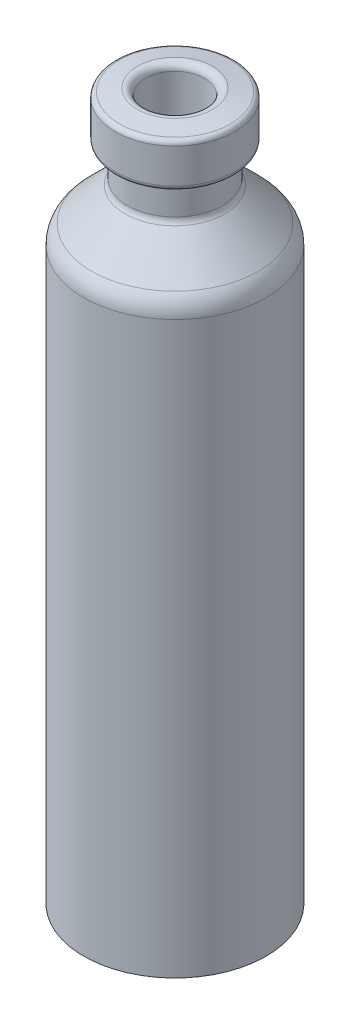
ISO-10303-21;
HEADER;
FILE_DESCRIPTION(('STEP AP214'),'2;1');
FILE_NAME('part.step','',(''),(''),'','','');
FILE_SCHEMA(('AUTOMOTIVE_DESIGN { 1 0 10303 214 1 1 1 1 }'));
ENDSEC;
DATA;
#1=APPLICATION_CONTEXT('core data for automotive mechanical design processes');
#2=APPLICATION_PROTOCOL_DEFINITION('international standard','automotive_design',2000,#1);
#3=PRODUCT_CONTEXT('',#1,'mechanical');
#4=PRODUCT('Part','Part','',(#3));
#5=PRODUCT_RELATED_PRODUCT_CATEGORY('part','',(#4));
#6=PRODUCT_DEFINITION_FORMATION('','',#4);
#7=PRODUCT_DEFINITION_CONTEXT('part definition',#1,'design');
#8=PRODUCT_DEFINITION('design','',#6,#7);
#9=PRODUCT_DEFINITION_SHAPE('','',#8);
#10=(LENGTH_UNIT() NAMED_UNIT(*) SI_UNIT(.MILLI.,.METRE.));
#11=(NAMED_UNIT(*) PLANE_ANGLE_UNIT() SI_UNIT($,.RADIAN.));
#12=(NAMED_UNIT(*) SI_UNIT($,.STERADIAN.) SOLID_ANGLE_UNIT());
#13=UNCERTAINTY_MEASURE_WITH_UNIT(LENGTH_MEASURE(1.E-05),#10,'distance_accuracy_value','');
#14=(GEOMETRIC_REPRESENTATION_CONTEXT(3) GLOBAL_UNCERTAINTY_ASSIGNED_CONTEXT((#13)) GLOBAL_UNIT_ASSIGNED_CONTEXT((#10,
#11,#12)) REPRESENTATION_CONTEXT('',''));
#15=CARTESIAN_POINT('',(0.,0.,0.));
#16=DIRECTION('',(0.,0.,1.));
#17=DIRECTION('',(1.,0.,0.));
#18=AXIS2_PLACEMENT_3D('',#15,#16,#17);
#19=CARTESIAN_POINT('',(0.,0.,0.85));
#20=DIRECTION('',(0.,-1.,0.));
#21=DIRECTION('',(0.,0.,-1.));
#22=AXIS2_PLACEMENT_3D('',#19,#20,#21);
#23=PLANE('',#22);
#24=CARTESIAN_POINT('',(0.,0.,5.475));
#25=DIRECTION('',(0.,-1.,0.));
#26=DIRECTION('',(0.,0.,-1.));
#27=AXIS2_PLACEMENT_3D('',#24,#25,#26);
#28=CIRCLE('',#27,5.475);
#29=CARTESIAN_POINT('',(0.,0.,0.));
#30=VERTEX_POINT('',#29);
#31=EDGE_CURVE('E10',#30,#30,#28,.T.);
#32=ORIENTED_EDGE('',*,*,#31,.T.);
#33=EDGE_LOOP('',(#32));
#34=FACE_BOUND('',#33,.T.);
#35=CARTESIAN_POINT('',(0.,0.,5.475));
#36=DIRECTION('',(0.,-1.,0.));
#37=DIRECTION('',(0.,0.,-1.));
#38=AXIS2_PLACEMENT_3D('',#35,#36,#37);
#39=CIRCLE('',#38,4.625);
#40=CARTESIAN_POINT('',(0.,0.,0.85));
#41=VERTEX_POINT('',#40);
#42=EDGE_CURVE('E93',#41,#41,#39,.T.);
#43=ORIENTED_EDGE('',*,*,#42,.F.);
#44=EDGE_LOOP('',(#43));
#45=FACE_BOUND('',#44,.T.);
#46=ADVANCED_FACE('F35',(#34,#45),#23,.T.);
#47=CARTESIAN_POINT('',(0.,0.,5.475));
#48=DIRECTION('',(0.,-1.,0.));
#49=DIRECTION('',(0.,0.,-1.));
#50=AXIS2_PLACEMENT_3D('',#47,#48,#49);
#51=CYLINDRICAL_SURFACE('',#50,5.475);
#52=CARTESIAN_POINT('',(0.,34.2327693881703,5.475));
#53=DIRECTION('',(0.,-1.,0.));
#54=DIRECTION('',(0.,0.,-1.));
#55=AXIS2_PLACEMENT_3D('',#52,#53,#54);
#56=CIRCLE('',#55,5.475);
#57=CARTESIAN_POINT('',(0.,34.2327693881703,0.));
#58=VERTEX_POINT('',#57);
#59=EDGE_CURVE('E41',#58,#58,#56,.T.);
#60=ORIENTED_EDGE('',*,*,#59,.T.);
#61=EDGE_LOOP('',(#60));
#62=FACE_BOUND('',#61,.T.);
#63=ORIENTED_EDGE('',*,*,#31,.F.);
#64=EDGE_LOOP('',(#63));
#65=FACE_BOUND('',#64,.T.);
#66=ADVANCED_FACE('F101',(#62,#65),#51,.T.);
#67=CARTESIAN_POINT('',(0.,34.2327693881703,5.475));
#68=DIRECTION('',(0.,-1.,0.));
#69=DIRECTION('',(0.,0.,-1.));
#70=AXIS2_PLACEMENT_3D('',#67,#68,#69);
#71=TOROIDAL_SURFACE('',#70,3.875,1.6);
#72=CARTESIAN_POINT('',(0.,35.3695404836065,5.475));
#73=DIRECTION('',(0.,-1.,0.));
#74=DIRECTION('',(0.,0.,-1.));
#75=AXIS2_PLACEMENT_3D('',#72,#73,#74);
#76=CIRCLE('',#75,5.00094470405111);
#77=CARTESIAN_POINT('',(0.,35.3695404836065,0.474055295948889));
#78=VERTEX_POINT('',#77);
#79=EDGE_CURVE('E45',#78,#78,#76,.T.);
#80=ORIENTED_EDGE('',*,*,#79,.T.);
#81=EDGE_LOOP('',(#80));
#82=FACE_BOUND('',#81,.T.);
#83=ORIENTED_EDGE('',*,*,#59,.F.);
#84=EDGE_LOOP('',(#83));
#85=FACE_BOUND('',#84,.T.);
#86=ADVANCED_FACE('F105',(#82,#85),#71,.T.);
#87=CARTESIAN_POINT('',(0.,35.3695404836065,5.475));
#88=DIRECTION('',(0.,-1.,0.));
#89=DIRECTION('',(0.,0.,-1.));
#90=AXIS2_PLACEMENT_3D('',#87,#88,#89);
#91=CONICAL_SURFACE('',#90,5.00094470405111,0.790182815880806);
#92=CARTESIAN_POINT('',(0.,37.353268598873,5.475));
#93=DIRECTION('',(0.,-1.,0.));
#94=DIRECTION('',(0.,0.,-1.));
#95=AXIS2_PLACEMENT_3D('',#92,#93,#94);
#96=CIRCLE('',#95,2.99814227998402);
#97=CARTESIAN_POINT('',(0.,37.353268598873,2.47685772001598));
#98=VERTEX_POINT('',#97);
#99=EDGE_CURVE('E49',#98,#98,#96,.T.);
#100=ORIENTED_EDGE('',*,*,#99,.T.);
#101=EDGE_LOOP('',(#100));
#102=FACE_BOUND('',#101,.T.);
#103=ORIENTED_EDGE('',*,*,#79,.F.);
#104=EDGE_LOOP('',(#103));
#105=FACE_BOUND('',#104,.T.);
#106=ADVANCED_FACE('F109',(#102,#105),#91,.T.);
#107=CARTESIAN_POINT('',(0.,37.7085095661968,5.475));
#108=DIRECTION('',(0.,-1.,0.));
#109=DIRECTION('',(0.,0.,-1.));
#110=AXIS2_PLACEMENT_3D('',#107,#108,#109);
#111=TOROIDAL_SURFACE('',#110,3.34999999999999,0.499999999999997);
#112=CARTESIAN_POINT('',(0.,37.7085095661968,5.475));
#113=DIRECTION('',(0.,-1.,0.));
#114=DIRECTION('',(0.,0.,-1.));
#115=AXIS2_PLACEMENT_3D('',#112,#113,#114);
#116=CIRCLE('',#115,2.85);
#117=CARTESIAN_POINT('',(0.,37.7085095661968,2.625));
#118=VERTEX_POINT('',#117);
#119=EDGE_CURVE('E54',#118,#118,#116,.T.);
#120=ORIENTED_EDGE('',*,*,#119,.T.);
#121=EDGE_LOOP('',(#120));
#122=FACE_BOUND('',#121,.T.);
#123=ORIENTED_EDGE('',*,*,#99,.F.);
#124=EDGE_LOOP('',(#123));
#125=FACE_BOUND('',#124,.T.);
#126=ADVANCED_FACE('F116',(#122,#125),#111,.F.);
#127=CARTESIAN_POINT('',(0.,0.,5.475));
#128=DIRECTION('',(0.,-1.,0.));
#129=DIRECTION('',(0.,0.,-1.));
#130=AXIS2_PLACEMENT_3D('',#127,#128,#129);
#131=CYLINDRICAL_SURFACE('',#130,2.85);
#132=CARTESIAN_POINT('',(0.,39.1755387390937,5.475));
#133=DIRECTION('',(0.,-1.,0.));
#134=DIRECTION('',(0.,0.,-1.));
#135=AXIS2_PLACEMENT_3D('',#132,#133,#134);
#136=CIRCLE('',#135,2.84999999999999);
#137=CARTESIAN_POINT('',(0.,39.1755387390937,2.625));
#138=VERTEX_POINT('',#137);
#139=EDGE_CURVE('E57',#138,#138,#136,.T.);
#140=ORIENTED_EDGE('',*,*,#139,.T.);
#141=EDGE_LOOP('',(#140));
#142=FACE_BOUND('',#141,.T.);
#143=ORIENTED_EDGE('',*,*,#119,.F.);
#144=EDGE_LOOP('',(#143));
#145=FACE_BOUND('',#144,.T.);
#146=ADVANCED_FACE('F120',(#142,#145),#131,.T.);
#147=CARTESIAN_POINT('',(0.,39.1755387390938,5.475));
#148=DIRECTION('',(0.,-1.,0.));
#149=DIRECTION('',(0.,0.,-1.));
#150=AXIS2_PLACEMENT_3D('',#147,#148,#149);
#151=TOROIDAL_SURFACE('',#150,3.15,0.300000000000001);
#152=CARTESIAN_POINT('',(0.,39.4653164869805,5.475));
#153=DIRECTION('',(0.,-1.,0.));
#154=DIRECTION('',(0.,0.,-1.));
#155=AXIS2_PLACEMENT_3D('',#152,#153,#154);
#156=CIRCLE('',#155,3.07235428646924);
#157=CARTESIAN_POINT('',(0.,39.4653164869805,2.40264571353076));
#158=VERTEX_POINT('',#157);
#159=EDGE_CURVE('E60',#158,#158,#156,.T.);
#160=ORIENTED_EDGE('',*,*,#159,.T.);
#161=EDGE_LOOP('',(#160));
#162=FACE_BOUND('',#161,.T.);
#163=ORIENTED_EDGE('',*,*,#139,.F.);
#164=EDGE_LOOP('',(#163));
#165=FACE_BOUND('',#164,.T.);
#166=ADVANCED_FACE('F124',(#162,#165),#151,.F.);
#167=CARTESIAN_POINT('',(0.,39.4653164869805,5.475));
#168=DIRECTION('',(0.,1.,0.));
#169=DIRECTION('',(0.,0.,1.));
#170=AXIS2_PLACEMENT_3D('',#167,#168,#169);
#171=CONICAL_SURFACE('',#170,3.07235428646924,1.30899693899574);
#172=CARTESIAN_POINT('',(0.,39.540420348507,5.475));
#173=DIRECTION('',(0.,-1.,0.));
#174=DIRECTION('',(0.,0.,-1.));
#175=AXIS2_PLACEMENT_3D('',#172,#173,#174);
#176=CIRCLE('',#175,3.35264571353076);
#177=CARTESIAN_POINT('',(0.,39.540420348507,2.12235428646924));
#178=VERTEX_POINT('',#177);
#179=EDGE_CURVE('E63',#178,#178,#176,.T.);
#180=ORIENTED_EDGE('',*,*,#179,.T.);
#181=EDGE_LOOP('',(#180));
#182=FACE_BOUND('',#181,.T.);
#183=ORIENTED_EDGE('',*,*,#159,.F.);
#184=EDGE_LOOP('',(#183));
#185=FACE_BOUND('',#184,.T.);
#186=ADVANCED_FACE('F128',(#182,#185),#171,.T.);
#187=CARTESIAN_POINT('',(0.,39.8301980963937,5.475));
#188=DIRECTION('',(0.,-1.,0.));
#189=DIRECTION('',(0.,0.,-1.));
#190=AXIS2_PLACEMENT_3D('',#187,#188,#189);
#191=TOROIDAL_SURFACE('',#190,3.27499999999999,0.300000000000001);
#192=CARTESIAN_POINT('',(0.,39.8301980963937,5.475));
#193=DIRECTION('',(0.,-1.,0.));
#194=DIRECTION('',(0.,0.,-1.));
#195=AXIS2_PLACEMENT_3D('',#192,#193,#194);
#196=CIRCLE('',#195,3.57499999999999);
#197=CARTESIAN_POINT('',(0.,39.8301980963937,1.90000000000001));
#198=VERTEX_POINT('',#197);
#199=EDGE_CURVE('E66',#198,#198,#196,.T.);
#200=ORIENTED_EDGE('',*,*,#199,.T.);
#201=EDGE_LOOP('',(#200));
#202=FACE_BOUND('',#201,.T.);
#203=ORIENTED_EDGE('',*,*,#179,.F.);
#204=EDGE_LOOP('',(#203));
#205=FACE_BOUND('',#204,.T.);
#206=ADVANCED_FACE('F132',(#202,#205),#191,.T.);
#207=CARTESIAN_POINT('',(0.,0.,5.475));
#208=DIRECTION('',(0.,-1.,0.));
#209=DIRECTION('',(0.,0.,-1.));
#210=AXIS2_PLACEMENT_3D('',#207,#208,#209);
#211=CYLINDRICAL_SURFACE('',#210,3.575);
#212=CARTESIAN_POINT('',(0.,41.9028145278069,5.475));
#213=DIRECTION('',(0.,-1.,0.));
#214=DIRECTION('',(0.,0.,-1.));
#215=AXIS2_PLACEMENT_3D('',#212,#213,#214);
#216=CIRCLE('',#215,3.575);
#217=CARTESIAN_POINT('',(0.,41.9028145278069,1.9));
#218=VERTEX_POINT('',#217);
#219=EDGE_CURVE('E69',#218,#218,#216,.T.);
#220=ORIENTED_EDGE('',*,*,#219,.T.);
#221=EDGE_LOOP('',(#220));
#222=FACE_BOUND('',#221,.T.);
#223=ORIENTED_EDGE('',*,*,#199,.F.);
#224=EDGE_LOOP('',(#223));
#225=FACE_BOUND('',#224,.T.);
#226=ADVANCED_FACE('F136',(#222,#225),#211,.T.);
#227=CARTESIAN_POINT('',(0.,41.9028145278069,5.475));
#228=DIRECTION('',(0.,-1.,0.));
#229=DIRECTION('',(0.,0.,-1.));
#230=AXIS2_PLACEMENT_3D('',#227,#228,#229);
#231=TOROIDAL_SURFACE('',#230,3.275,0.300000000000008);
#232=CARTESIAN_POINT('',(0.,42.1973026828412,5.475));
#233=DIRECTION('',(0.,-1.,0.));
#234=DIRECTION('',(0.,0.,-1.));
#235=AXIS2_PLACEMENT_3D('',#232,#233,#234);
#236=CIRCLE('',#235,3.33224269861296);
#237=CARTESIAN_POINT('',(0.,42.1973026828412,2.14275730138704));
#238=VERTEX_POINT('',#237);
#239=EDGE_CURVE('E72',#238,#238,#236,.T.);
#240=ORIENTED_EDGE('',*,*,#239,.T.);
#241=EDGE_LOOP('',(#240));
#242=FACE_BOUND('',#241,.T.);
#243=ORIENTED_EDGE('',*,*,#219,.F.);
#244=EDGE_LOOP('',(#243));
#245=FACE_BOUND('',#244,.T.);
#246=ADVANCED_FACE('F140',(#242,#245),#231,.T.);
#247=CARTESIAN_POINT('',(0.,42.1973026828412,5.475));
#248=DIRECTION('',(0.,-1.,0.));
#249=DIRECTION('',(0.,0.,-1.));
#250=AXIS2_PLACEMENT_3D('',#247,#248,#249);
#251=CONICAL_SURFACE('',#250,3.33224269861296,1.37881010907552);
#252=CARTESIAN_POINT('',(0.,42.4074120717419,5.475));
#253=DIRECTION('',(0.,-1.,0.));
#254=DIRECTION('',(0.,0.,-1.));
#255=AXIS2_PLACEMENT_3D('',#252,#253,#254);
#256=CIRCLE('',#255,2.25132359815062);
#257=CARTESIAN_POINT('',(0.,42.4074120717419,3.22367640184938));
#258=VERTEX_POINT('',#257);
#259=EDGE_CURVE('E75',#258,#258,#256,.T.);
#260=ORIENTED_EDGE('',*,*,#259,.T.);
#261=EDGE_LOOP('',(#260));
#262=FACE_BOUND('',#261,.T.);
#263=ORIENTED_EDGE('',*,*,#239,.F.);
#264=EDGE_LOOP('',(#263));
#265=FACE_BOUND('',#264,.T.);
#266=ADVANCED_FACE('F144',(#262,#265),#251,.T.);
#267=CARTESIAN_POINT('',(0.,42.0147611983628,5.475));
#268=DIRECTION('',(0.,-1.,0.));
#269=DIRECTION('',(0.,0.,-1.));
#270=AXIS2_PLACEMENT_3D('',#267,#268,#269);
#271=TOROIDAL_SURFACE('',#270,2.175,0.4);
#272=CARTESIAN_POINT('',(0.,42.0147611983628,5.475));
#273=DIRECTION('',(0.,-1.,0.));
#274=DIRECTION('',(0.,0.,-1.));
#275=AXIS2_PLACEMENT_3D('',#272,#273,#274);
#276=CIRCLE('',#275,1.775);
#277=CARTESIAN_POINT('',(0.,42.0147611983628,3.7));
#278=VERTEX_POINT('',#277);
#279=EDGE_CURVE('E78',#278,#278,#276,.T.);
#280=ORIENTED_EDGE('',*,*,#279,.T.);
#281=EDGE_LOOP('',(#280));
#282=FACE_BOUND('',#281,.T.);
#283=ORIENTED_EDGE('',*,*,#259,.F.);
#284=EDGE_LOOP('',(#283));
#285=FACE_BOUND('',#284,.T.);
#286=ADVANCED_FACE('F148',(#282,#285),#271,.T.);
#287=CARTESIAN_POINT('',(0.,0.,5.475));
#288=DIRECTION('',(0.,-1.,0.));
#289=DIRECTION('',(0.,0.,-1.));
#290=AXIS2_PLACEMENT_3D('',#287,#288,#289);
#291=CYLINDRICAL_SURFACE('',#290,1.775);
#292=CARTESIAN_POINT('',(0.,37.3657761480889,5.475));
#293=DIRECTION('',(0.,-1.,0.));
#294=DIRECTION('',(0.,0.,-1.));
#295=AXIS2_PLACEMENT_3D('',#292,#293,#294);
#296=CIRCLE('',#295,1.775);
#297=CARTESIAN_POINT('',(0.,37.3657761480889,3.7));
#298=VERTEX_POINT('',#297);
#299=EDGE_CURVE('E81',#298,#298,#296,.T.);
#300=ORIENTED_EDGE('',*,*,#299,.T.);
#301=EDGE_LOOP('',(#300));
#302=FACE_BOUND('',#301,.T.);
#303=ORIENTED_EDGE('',*,*,#279,.F.);
#304=EDGE_LOOP('',(#303));
#305=FACE_BOUND('',#304,.T.);
#306=ADVANCED_FACE('F152',(#302,#305),#291,.F.);
#307=CARTESIAN_POINT('',(0.,37.3657761480889,5.475));
#308=DIRECTION('',(0.,-1.,0.));
#309=DIRECTION('',(0.,0.,-1.));
#310=AXIS2_PLACEMENT_3D('',#307,#308,#309);
#311=TOROIDAL_SURFACE('',#310,2.275,0.5);
#312=CARTESIAN_POINT('',(0.,37.0105351807651,5.475));
#313=DIRECTION('',(0.,-1.,0.));
#314=DIRECTION('',(0.,0.,-1.));
#315=AXIS2_PLACEMENT_3D('',#312,#313,#314);
#316=CIRCLE('',#315,1.92314227998403);
#317=CARTESIAN_POINT('',(0.,37.0105351807651,3.55185772001597));
#318=VERTEX_POINT('',#317);
#319=EDGE_CURVE('E84',#318,#318,#316,.T.);
#320=ORIENTED_EDGE('',*,*,#319,.T.);
#321=EDGE_LOOP('',(#320));
#322=FACE_BOUND('',#321,.T.);
#323=ORIENTED_EDGE('',*,*,#299,.F.);
#324=EDGE_LOOP('',(#323));
#325=FACE_BOUND('',#324,.T.);
#326=ADVANCED_FACE('F156',(#322,#325),#311,.T.);
#327=CARTESIAN_POINT('',(0.,37.0105351807651,5.475));
#328=DIRECTION('',(0.,-1.,0.));
#329=DIRECTION('',(0.,0.,-1.));
#330=AXIS2_PLACEMENT_3D('',#327,#328,#329);
#331=CONICAL_SURFACE('',#330,1.92314227998403,0.790182815880806);
#332=CARTESIAN_POINT('',(0.,34.8039499226415,5.475));
#333=DIRECTION('',(0.,-1.,0.));
#334=DIRECTION('',(0.,0.,-1.));
#335=AXIS2_PLACEMENT_3D('',#332,#333,#334);
#336=CIRCLE('',#335,4.15094470405111);
#337=CARTESIAN_POINT('',(0.,34.8039499226415,1.32405529594889));
#338=VERTEX_POINT('',#337);
#339=EDGE_CURVE('E87',#338,#338,#336,.T.);
#340=ORIENTED_EDGE('',*,*,#339,.T.);
#341=EDGE_LOOP('',(#340));
#342=FACE_BOUND('',#341,.T.);
#343=ORIENTED_EDGE('',*,*,#319,.F.);
#344=EDGE_LOOP('',(#343));
#345=FACE_BOUND('',#344,.T.);
#346=ADVANCED_FACE('F160',(#342,#345),#331,.F.);
#347=CARTESIAN_POINT('',(0.,33.6671788272053,5.475));
#348=DIRECTION('',(0.,-1.,0.));
#349=DIRECTION('',(0.,0.,-1.));
#350=AXIS2_PLACEMENT_3D('',#347,#348,#349);
#351=TOROIDAL_SURFACE('',#350,3.025,1.6);
#352=CARTESIAN_POINT('',(0.,33.6671788272053,5.475));
#353=DIRECTION('',(0.,-1.,0.));
#354=DIRECTION('',(0.,0.,-1.));
#355=AXIS2_PLACEMENT_3D('',#352,#353,#354);
#356=CIRCLE('',#355,4.625);
#357=CARTESIAN_POINT('',(0.,33.6671788272053,0.849999999999997));
#358=VERTEX_POINT('',#357);
#359=EDGE_CURVE('E90',#358,#358,#356,.T.);
#360=ORIENTED_EDGE('',*,*,#359,.T.);
#361=EDGE_LOOP('',(#360));
#362=FACE_BOUND('',#361,.T.);
#363=ORIENTED_EDGE('',*,*,#339,.F.);
#364=EDGE_LOOP('',(#363));
#365=FACE_BOUND('',#364,.T.);
#366=ADVANCED_FACE('F164',(#362,#365),#351,.F.);
#367=CARTESIAN_POINT('',(0.,0.,5.475));
#368=DIRECTION('',(0.,-1.,0.));
#369=DIRECTION('',(0.,0.,-1.));
#370=AXIS2_PLACEMENT_3D('',#367,#368,#369);
#371=CYLINDRICAL_SURFACE('',#370,4.625);
#372=ORIENTED_EDGE('',*,*,#42,.T.);
#373=EDGE_LOOP('',(#372));
#374=FACE_BOUND('',#373,.T.);
#375=ORIENTED_EDGE('',*,*,#359,.F.);
#376=EDGE_LOOP('',(#375));
#377=FACE_BOUND('',#376,.T.);
#378=ADVANCED_FACE('F97',(#374,#377),#371,.F.);
#379=CLOSED_SHELL('',(#46,#66,#86,#106,#126,#146,#166,#186,#206,#226,#246,#266,#286,#306,#326,
#346,#366,#378));
#380=MANIFOLD_SOLID_BREP('B2',#379);
#381=ADVANCED_BREP_SHAPE_REPRESENTATION('',(#18,#380),#14);
#382=SHAPE_DEFINITION_REPRESENTATION(#9,#381);
ENDSEC;
END-ISO-10303-21;
